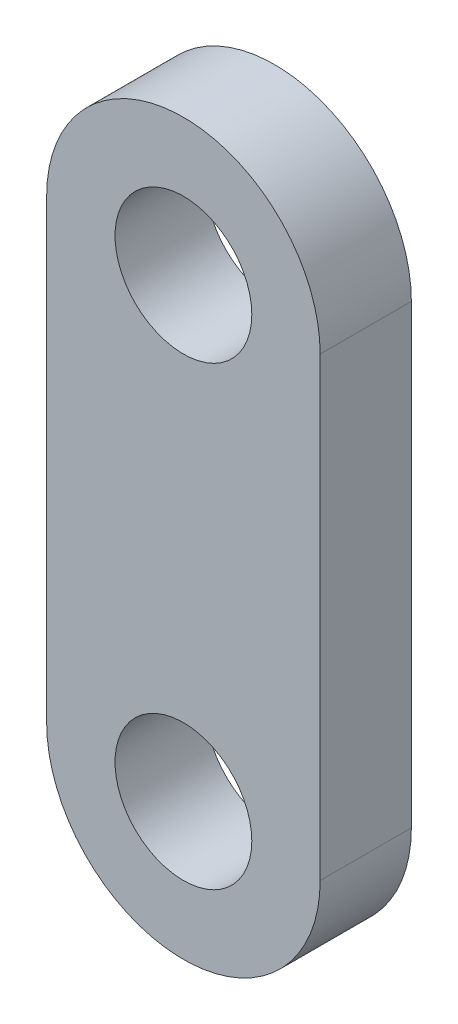
ISO-10303-21;
HEADER;
FILE_DESCRIPTION(('STEP AP214'),'2;1');
FILE_NAME('part.step','',(''),(''),'','','');
FILE_SCHEMA(('AUTOMOTIVE_DESIGN { 1 0 10303 214 1 1 1 1 }'));
ENDSEC;
DATA;
#1=APPLICATION_CONTEXT('core data for automotive mechanical design processes');
#2=APPLICATION_PROTOCOL_DEFINITION('international standard','automotive_design',2000,#1);
#3=PRODUCT_CONTEXT('',#1,'mechanical');
#4=PRODUCT('Part','Part','',(#3));
#5=PRODUCT_RELATED_PRODUCT_CATEGORY('part','',(#4));
#6=PRODUCT_DEFINITION_FORMATION('','',#4);
#7=PRODUCT_DEFINITION_CONTEXT('part definition',#1,'design');
#8=PRODUCT_DEFINITION('design','',#6,#7);
#9=PRODUCT_DEFINITION_SHAPE('','',#8);
#10=(LENGTH_UNIT() NAMED_UNIT(*) SI_UNIT(.MILLI.,.METRE.));
#11=(NAMED_UNIT(*) PLANE_ANGLE_UNIT() SI_UNIT($,.RADIAN.));
#12=(NAMED_UNIT(*) SI_UNIT($,.STERADIAN.) SOLID_ANGLE_UNIT());
#13=UNCERTAINTY_MEASURE_WITH_UNIT(LENGTH_MEASURE(1.E-05),#10,'distance_accuracy_value','');
#14=(GEOMETRIC_REPRESENTATION_CONTEXT(3) GLOBAL_UNCERTAINTY_ASSIGNED_CONTEXT((#13)) GLOBAL_UNIT_ASSIGNED_CONTEXT((#10,
#11,#12)) REPRESENTATION_CONTEXT('',''));
#15=CARTESIAN_POINT('',(0.,0.,0.));
#16=DIRECTION('',(0.,0.,1.));
#17=DIRECTION('',(1.,0.,0.));
#18=AXIS2_PLACEMENT_3D('',#15,#16,#17);
#19=CARTESIAN_POINT('',(0.,0.,2.));
#20=DIRECTION('',(0.,0.,1.));
#21=DIRECTION('',(1.,0.,0.));
#22=AXIS2_PLACEMENT_3D('',#19,#20,#21);
#23=PLANE('',#22);
#24=CARTESIAN_POINT('',(0.,0.,2.));
#25=DIRECTION('',(0.,0.,1.));
#26=DIRECTION('',(1.,0.,0.));
#27=AXIS2_PLACEMENT_3D('',#24,#25,#26);
#28=CIRCLE('',#27,1.5);
#29=CARTESIAN_POINT('',(1.5,0.,2.));
#30=VERTEX_POINT('',#29);
#31=EDGE_CURVE('E129',#30,#30,#28,.T.);
#32=ORIENTED_EDGE('',*,*,#31,.F.);
#33=EDGE_LOOP('',(#32));
#34=FACE_BOUND('',#33,.T.);
#35=CARTESIAN_POINT('',(0.,0.,2.));
#36=DIRECTION('',(0.,0.,1.));
#37=DIRECTION('',(1.,0.,0.));
#38=AXIS2_PLACEMENT_3D('',#35,#36,#37);
#39=CIRCLE('',#38,3.);
#40=CARTESIAN_POINT('',(3.,0.,2.));
#41=VERTEX_POINT('',#40);
#42=CARTESIAN_POINT('',(-3.,0.,2.));
#43=VERTEX_POINT('',#42);
#44=EDGE_CURVE('E113',#41,#43,#39,.T.);
#45=ORIENTED_EDGE('',*,*,#44,.T.);
#46=DIRECTION('',(0.,-1.,0.));
#47=VECTOR('',#46,1.);
#48=CARTESIAN_POINT('',(-3.,0.,2.));
#49=LINE('',#48,#47);
#50=CARTESIAN_POINT('',(-3.,-10.,2.));
#51=VERTEX_POINT('',#50);
#52=EDGE_CURVE('E105',#43,#51,#49,.T.);
#53=ORIENTED_EDGE('',*,*,#52,.T.);
#54=CARTESIAN_POINT('',(0.,-10.,2.));
#55=DIRECTION('',(0.,0.,-1.));
#56=DIRECTION('',(-1.,0.,0.));
#57=AXIS2_PLACEMENT_3D('',#54,#55,#56);
#58=CIRCLE('',#57,3.);
#59=CARTESIAN_POINT('',(3.,-10.,2.));
#60=VERTEX_POINT('',#59);
#61=EDGE_CURVE('E112',#60,#51,#58,.T.);
#62=ORIENTED_EDGE('',*,*,#61,.F.);
#63=DIRECTION('',(0.,-1.,0.));
#64=VECTOR('',#63,1.);
#65=CARTESIAN_POINT('',(3.,0.,2.));
#66=LINE('',#65,#64);
#67=EDGE_CURVE('E122',#41,#60,#66,.T.);
#68=ORIENTED_EDGE('',*,*,#67,.F.);
#69=EDGE_LOOP('',(#45,#53,#62,#68));
#70=FACE_BOUND('',#69,.T.);
#71=CARTESIAN_POINT('',(0.,-10.,2.));
#72=DIRECTION('',(0.,0.,1.));
#73=DIRECTION('',(1.,0.,0.));
#74=AXIS2_PLACEMENT_3D('',#71,#72,#73);
#75=CIRCLE('',#74,1.5);
#76=CARTESIAN_POINT('',(1.5,-10.,2.));
#77=VERTEX_POINT('',#76);
#78=EDGE_CURVE('E142',#77,#77,#75,.T.);
#79=ORIENTED_EDGE('',*,*,#78,.F.);
#80=EDGE_LOOP('',(#79));
#81=FACE_BOUND('',#80,.T.);
#82=ADVANCED_FACE('F63',(#34,#70,#81),#23,.T.);
#83=CARTESIAN_POINT('',(0.,0.,0.));
#84=DIRECTION('',(0.,0.,1.));
#85=DIRECTION('',(1.,0.,0.));
#86=AXIS2_PLACEMENT_3D('',#83,#84,#85);
#87=PLANE('',#86);
#88=CARTESIAN_POINT('',(0.,0.,0.));
#89=DIRECTION('',(0.,0.,1.));
#90=DIRECTION('',(1.,0.,0.));
#91=AXIS2_PLACEMENT_3D('',#88,#89,#90);
#92=CIRCLE('',#91,3.);
#93=CARTESIAN_POINT('',(3.,0.,0.));
#94=VERTEX_POINT('',#93);
#95=CARTESIAN_POINT('',(-3.,0.,0.));
#96=VERTEX_POINT('',#95);
#97=EDGE_CURVE('E127',#94,#96,#92,.T.);
#98=ORIENTED_EDGE('',*,*,#97,.F.);
#99=DIRECTION('',(0.,-1.,0.));
#100=VECTOR('',#99,1.);
#101=CARTESIAN_POINT('',(3.,0.,0.));
#102=LINE('',#101,#100);
#103=CARTESIAN_POINT('',(3.,-10.,0.));
#104=VERTEX_POINT('',#103);
#105=EDGE_CURVE('E133',#94,#104,#102,.T.);
#106=ORIENTED_EDGE('',*,*,#105,.T.);
#107=CARTESIAN_POINT('',(0.,-10.,0.));
#108=DIRECTION('',(0.,0.,-1.));
#109=DIRECTION('',(-1.,0.,0.));
#110=AXIS2_PLACEMENT_3D('',#107,#108,#109);
#111=CIRCLE('',#110,3.);
#112=CARTESIAN_POINT('',(-3.,-10.,0.));
#113=VERTEX_POINT('',#112);
#114=EDGE_CURVE('E131',#104,#113,#111,.T.);
#115=ORIENTED_EDGE('',*,*,#114,.T.);
#116=DIRECTION('',(0.,-1.,0.));
#117=VECTOR('',#116,1.);
#118=CARTESIAN_POINT('',(-3.,0.,0.));
#119=LINE('',#118,#117);
#120=EDGE_CURVE('E118',#96,#113,#119,.T.);
#121=ORIENTED_EDGE('',*,*,#120,.F.);
#122=EDGE_LOOP('',(#98,#106,#115,#121));
#123=FACE_BOUND('',#122,.T.);
#124=CARTESIAN_POINT('',(0.,0.,0.));
#125=DIRECTION('',(0.,0.,1.));
#126=DIRECTION('',(1.,0.,0.));
#127=AXIS2_PLACEMENT_3D('',#124,#125,#126);
#128=CIRCLE('',#127,1.5);
#129=CARTESIAN_POINT('',(1.5,0.,0.));
#130=VERTEX_POINT('',#129);
#131=EDGE_CURVE('E139',#130,#130,#128,.T.);
#132=ORIENTED_EDGE('',*,*,#131,.T.);
#133=EDGE_LOOP('',(#132));
#134=FACE_BOUND('',#133,.T.);
#135=CARTESIAN_POINT('',(0.,-10.,0.));
#136=DIRECTION('',(0.,0.,1.));
#137=DIRECTION('',(1.,0.,0.));
#138=AXIS2_PLACEMENT_3D('',#135,#136,#137);
#139=CIRCLE('',#138,1.5);
#140=CARTESIAN_POINT('',(1.5,-10.,0.));
#141=VERTEX_POINT('',#140);
#142=EDGE_CURVE('E145',#141,#141,#139,.T.);
#143=ORIENTED_EDGE('',*,*,#142,.T.);
#144=EDGE_LOOP('',(#143));
#145=FACE_BOUND('',#144,.T.);
#146=ADVANCED_FACE('F154',(#123,#134,#145),#87,.F.);
#147=CARTESIAN_POINT('',(0.,0.,2.));
#148=DIRECTION('',(0.,0.,-1.));
#149=DIRECTION('',(-1.,0.,0.));
#150=AXIS2_PLACEMENT_3D('',#147,#148,#149);
#151=CYLINDRICAL_SURFACE('',#150,3.);
#152=ORIENTED_EDGE('',*,*,#97,.T.);
#153=DIRECTION('',(0.,0.,-1.));
#154=VECTOR('',#153,1.);
#155=CARTESIAN_POINT('',(-3.,0.,2.));
#156=LINE('',#155,#154);
#157=EDGE_CURVE('E12',#43,#96,#156,.T.);
#158=ORIENTED_EDGE('',*,*,#157,.F.);
#159=ORIENTED_EDGE('',*,*,#44,.F.);
#160=DIRECTION('',(0.,0.,-1.));
#161=VECTOR('',#160,1.);
#162=CARTESIAN_POINT('',(3.,0.,2.));
#163=LINE('',#162,#161);
#164=EDGE_CURVE('E80',#41,#94,#163,.T.);
#165=ORIENTED_EDGE('',*,*,#164,.T.);
#166=EDGE_LOOP('',(#152,#158,#159,#165));
#167=FACE_BOUND('',#166,.T.);
#168=ADVANCED_FACE('F65',(#167),#151,.T.);
#169=CARTESIAN_POINT('',(-3.,0.,2.));
#170=DIRECTION('',(1.,0.,0.));
#171=DIRECTION('',(0.,0.,-1.));
#172=AXIS2_PLACEMENT_3D('',#169,#170,#171);
#173=PLANE('',#172);
#174=ORIENTED_EDGE('',*,*,#120,.T.);
#175=DIRECTION('',(0.,0.,-1.));
#176=VECTOR('',#175,1.);
#177=CARTESIAN_POINT('',(-3.,-10.,2.));
#178=LINE('',#177,#176);
#179=EDGE_CURVE('E72',#51,#113,#178,.T.);
#180=ORIENTED_EDGE('',*,*,#179,.F.);
#181=ORIENTED_EDGE('',*,*,#52,.F.);
#182=ORIENTED_EDGE('',*,*,#157,.T.);
#183=EDGE_LOOP('',(#174,#180,#181,#182));
#184=FACE_BOUND('',#183,.T.);
#185=ADVANCED_FACE('F117',(#184),#173,.F.);
#186=CARTESIAN_POINT('',(0.,-10.,2.));
#187=DIRECTION('',(0.,0.,-1.));
#188=DIRECTION('',(-1.,0.,0.));
#189=AXIS2_PLACEMENT_3D('',#186,#187,#188);
#190=CYLINDRICAL_SURFACE('',#189,3.);
#191=ORIENTED_EDGE('',*,*,#114,.F.);
#192=DIRECTION('',(0.,0.,-1.));
#193=VECTOR('',#192,1.);
#194=CARTESIAN_POINT('',(3.,-10.,2.));
#195=LINE('',#194,#193);
#196=EDGE_CURVE('E94',#60,#104,#195,.T.);
#197=ORIENTED_EDGE('',*,*,#196,.F.);
#198=ORIENTED_EDGE('',*,*,#61,.T.);
#199=ORIENTED_EDGE('',*,*,#179,.T.);
#200=EDGE_LOOP('',(#191,#197,#198,#199));
#201=FACE_BOUND('',#200,.T.);
#202=ADVANCED_FACE('F121',(#201),#190,.T.);
#203=CARTESIAN_POINT('',(3.,0.,2.));
#204=DIRECTION('',(1.,0.,0.));
#205=DIRECTION('',(0.,0.,-1.));
#206=AXIS2_PLACEMENT_3D('',#203,#204,#205);
#207=PLANE('',#206);
#208=ORIENTED_EDGE('',*,*,#105,.F.);
#209=ORIENTED_EDGE('',*,*,#164,.F.);
#210=ORIENTED_EDGE('',*,*,#67,.T.);
#211=ORIENTED_EDGE('',*,*,#196,.T.);
#212=EDGE_LOOP('',(#208,#209,#210,#211));
#213=FACE_BOUND('',#212,.T.);
#214=ADVANCED_FACE('F166',(#213),#207,.T.);
#215=CARTESIAN_POINT('',(0.,0.,2.));
#216=DIRECTION('',(0.,0.,-1.));
#217=DIRECTION('',(-1.,0.,0.));
#218=AXIS2_PLACEMENT_3D('',#215,#216,#217);
#219=CYLINDRICAL_SURFACE('',#218,1.5);
#220=ORIENTED_EDGE('',*,*,#31,.T.);
#221=EDGE_LOOP('',(#220));
#222=FACE_BOUND('',#221,.T.);
#223=ORIENTED_EDGE('',*,*,#131,.F.);
#224=EDGE_LOOP('',(#223));
#225=FACE_BOUND('',#224,.T.);
#226=ADVANCED_FACE('F163',(#222,#225),#219,.F.);
#227=CARTESIAN_POINT('',(0.,-10.,2.));
#228=DIRECTION('',(0.,0.,-1.));
#229=DIRECTION('',(-1.,0.,0.));
#230=AXIS2_PLACEMENT_3D('',#227,#228,#229);
#231=CYLINDRICAL_SURFACE('',#230,1.5);
#232=ORIENTED_EDGE('',*,*,#78,.T.);
#233=EDGE_LOOP('',(#232));
#234=FACE_BOUND('',#233,.T.);
#235=ORIENTED_EDGE('',*,*,#142,.F.);
#236=EDGE_LOOP('',(#235));
#237=FACE_BOUND('',#236,.T.);
#238=ADVANCED_FACE('F151',(#234,#237),#231,.F.);
#239=CLOSED_SHELL('',(#82,#146,#168,#185,#202,#214,#226,#238));
#240=MANIFOLD_SOLID_BREP('B2',#239);
#241=ADVANCED_BREP_SHAPE_REPRESENTATION('',(#18,#240),#14);
#242=SHAPE_DEFINITION_REPRESENTATION(#9,#241);
ENDSEC;
END-ISO-10303-21;
